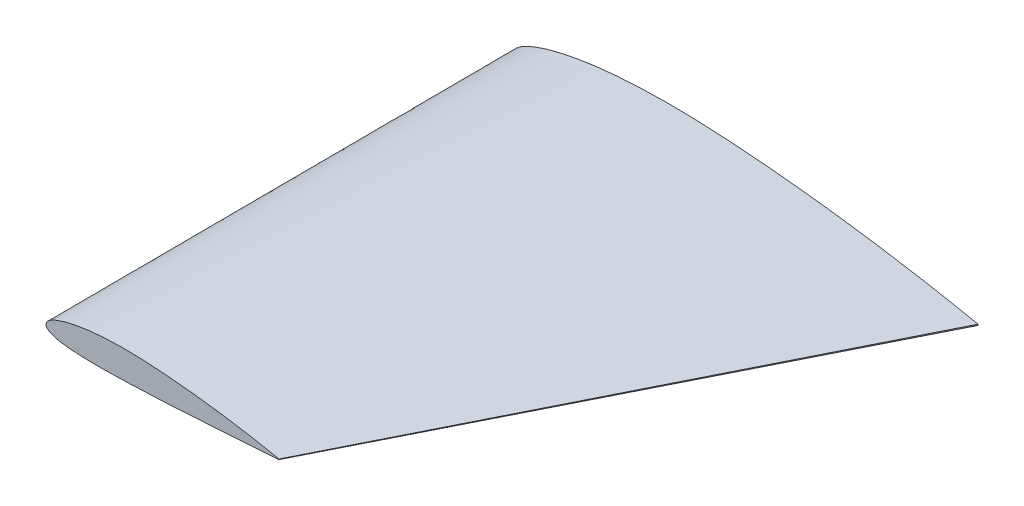
ISO-10303-21;
HEADER;
FILE_DESCRIPTION(('STEP AP214'),'2;1');
FILE_NAME('part.step','',(''),(''),'','','');
FILE_SCHEMA(('AUTOMOTIVE_DESIGN { 1 0 10303 214 1 1 1 1 }'));
ENDSEC;
DATA;
#1=APPLICATION_CONTEXT('core data for automotive mechanical design processes');
#2=APPLICATION_PROTOCOL_DEFINITION('international standard','automotive_design',2000,#1);
#3=PRODUCT_CONTEXT('',#1,'mechanical');
#4=PRODUCT('Part','Part','',(#3));
#5=PRODUCT_RELATED_PRODUCT_CATEGORY('part','',(#4));
#6=PRODUCT_DEFINITION_FORMATION('','',#4);
#7=PRODUCT_DEFINITION_CONTEXT('part definition',#1,'design');
#8=PRODUCT_DEFINITION('design','',#6,#7);
#9=PRODUCT_DEFINITION_SHAPE('','',#8);
#10=(LENGTH_UNIT() NAMED_UNIT(*) SI_UNIT(.MILLI.,.METRE.));
#11=(NAMED_UNIT(*) PLANE_ANGLE_UNIT() SI_UNIT($,.RADIAN.));
#12=(NAMED_UNIT(*) SI_UNIT($,.STERADIAN.) SOLID_ANGLE_UNIT());
#13=UNCERTAINTY_MEASURE_WITH_UNIT(LENGTH_MEASURE(1.E-05),#10,'distance_accuracy_value','');
#14=(GEOMETRIC_REPRESENTATION_CONTEXT(3) GLOBAL_UNCERTAINTY_ASSIGNED_CONTEXT((#13)) GLOBAL_UNIT_ASSIGNED_CONTEXT((#10,
#11,#12)) REPRESENTATION_CONTEXT('',''));
#15=CARTESIAN_POINT('',(0.,0.,0.));
#16=DIRECTION('',(0.,0.,1.));
#17=DIRECTION('',(1.,0.,0.));
#18=AXIS2_PLACEMENT_3D('',#15,#16,#17);
#19=CARTESIAN_POINT('',(0.0474942023796356,0.362779535333563,100.));
#20=DIRECTION('',(0.,0.,-1.));
#21=DIRECTION('',(-1.,0.,0.));
#22=AXIS2_PLACEMENT_3D('',#19,#20,#21);
#23=PLANE('',#22);
#24=CARTESIAN_POINT('',(50.0042,0.06285,100.));
#25=CARTESIAN_POINT('',(49.9787503208939,0.0681515408779686,100.));
#26=CARTESIAN_POINT('',(49.8770960081783,0.0893276229824436,100.));
#27=CARTESIAN_POINT('',(49.6489384785891,0.136683489370867,100.));
#28=CARTESIAN_POINT('',(49.2701415094304,0.214627614186905,100.));
#29=CARTESIAN_POINT('',(48.7428627202459,0.321624115873759,100.));
#30=CARTESIAN_POINT('',(48.0702166717391,0.455902247108572,100.));
#31=CARTESIAN_POINT('',(47.2560872043922,0.614960305443104,100.));
#32=CARTESIAN_POINT('',(46.305254560152,0.796054170764651,100.));
#33=CARTESIAN_POINT('',(45.2233170197372,0.996240875897276,100.));
#34=CARTESIAN_POINT('',(44.0166438216551,1.21211261946796,100.));
#35=CARTESIAN_POINT('',(42.6924447726698,1.44030751234326,100.));
#36=CARTESIAN_POINT('',(41.2586094418726,1.67737165349885,100.));
#37=CARTESIAN_POINT('',(39.7237398709336,1.91965685601623,100.));
#38=CARTESIAN_POINT('',(38.0970889627317,2.16359838588722,100.));
#39=CARTESIAN_POINT('',(36.3885501164969,2.40569281055512,100.));
#40=CARTESIAN_POINT('',(34.6085097978796,2.64231100068004,100.));
#41=CARTESIAN_POINT('',(32.7678510359656,2.86995189203715,100.));
#42=CARTESIAN_POINT('',(30.8778789601217,3.08535944017153,100.));
#43=CARTESIAN_POINT('',(28.9502308951007,3.28476381946373,100.));
#44=CARTESIAN_POINT('',(26.9968658516866,3.46526635096218,100.));
#45=CARTESIAN_POINT('',(25.0299180376006,3.62322388986461,100.));
#46=CARTESIAN_POINT('',(23.0616967066698,3.75605470727349,100.));
#47=CARTESIAN_POINT('',(21.1022971488884,3.860617181408,100.));
#48=CARTESIAN_POINT('',(19.1611200346032,3.93555294402119,100.));
#49=CARTESIAN_POINT('',(17.2501237020236,3.96707959022297,100.));
#50=CARTESIAN_POINT('',(15.3841597719049,3.95494837649114,100.));
#51=CARTESIAN_POINT('',(13.5784057428132,3.89887966716852,100.));
#52=CARTESIAN_POINT('',(11.8447981681396,3.79955254024002,100.));
#53=CARTESIAN_POINT('',(10.194804575866,3.65844393973575,100.));
#54=CARTESIAN_POINT('',(8.63925035051942,3.47803601710994,100.));
#55=CARTESIAN_POINT('',(7.18830146576011,3.26135690626958,100.));
#56=CARTESIAN_POINT('',(5.85126076701978,3.01224058873252,100.));
#57=CARTESIAN_POINT('',(4.63658778482368,2.73491121721397,100.));
#58=CARTESIAN_POINT('',(3.55161530454614,2.43433976452903,100.));
#59=CARTESIAN_POINT('',(2.60276441860869,2.115168266014,100.));
#60=CARTESIAN_POINT('',(1.79505140803959,1.7824667468098,100.));
#61=CARTESIAN_POINT('',(1.13224252541142,1.440663698548,100.));
#62=CARTESIAN_POINT('',(0.615990391680703,1.09315191705185,100.));
#63=CARTESIAN_POINT('',(0.246588870575284,0.74065659632003,100.));
#64=CARTESIAN_POINT('',(0.0242761352622945,0.376168780783406,100.));
#65=CARTESIAN_POINT('',(-0.0285068296811522,-0.00285520885615475,100.));
#66=CARTESIAN_POINT('',(0.0981216237119124,-0.363599767004052,100.));
#67=CARTESIAN_POINT('',(0.385885654781872,-0.677224455305556,100.));
#68=CARTESIAN_POINT('',(0.812849555282521,-0.951837373953946,100.));
#69=CARTESIAN_POINT('',(1.37887384048224,-1.19636133992195,100.));
#70=CARTESIAN_POINT('',(2.08301144224068,-1.41204451983937,100.));
#71=CARTESIAN_POINT('',(2.92231436887799,-1.59913003106045,100.));
#72=CARTESIAN_POINT('',(3.89219369558383,-1.75714214496304,100.));
#73=CARTESIAN_POINT('',(4.98694192534886,-1.88593892445276,100.));
#74=CARTESIAN_POINT('',(6.19999197219387,-1.9857271995877,100.));
#75=CARTESIAN_POINT('',(7.52410902909223,-2.05734927163072,100.));
#76=CARTESIAN_POINT('',(8.9514977724483,-2.10194737609152,100.));
#77=CARTESIAN_POINT('',(10.4738378106142,-2.12137948268366,100.));
#78=CARTESIAN_POINT('',(12.0823639955289,-2.11775490771724,100.));
#79=CARTESIAN_POINT('',(13.7678675171911,-2.09394954533398,100.));
#80=CARTESIAN_POINT('',(15.5207487182737,-2.05286362155699,100.));
#81=CARTESIAN_POINT('',(17.3310321776149,-1.99806311276751,100.));
#82=CARTESIAN_POINT('',(19.1912633395836,-1.93243554850442,100.));
#83=CARTESIAN_POINT('',(21.0929729390296,-1.86056227364106,100.));
#84=CARTESIAN_POINT('',(23.0244613766069,-1.77364601843777,100.));
#85=CARTESIAN_POINT('',(24.9712196743713,-1.67603728101522,100.));
#86=CARTESIAN_POINT('',(26.9192089763072,-1.56986322392175,100.));
#87=CARTESIAN_POINT('',(28.8566084634673,-1.45814063510328,100.));
#88=CARTESIAN_POINT('',(30.7715882233796,-1.34290086674459,100.));
#89=CARTESIAN_POINT('',(32.6523987631463,-1.2263938089715,100.));
#90=CARTESIAN_POINT('',(34.4874415882626,-1.11011209934819,100.));
#91=CARTESIAN_POINT('',(36.2653770661032,-0.995692317322224,100.));
#92=CARTESIAN_POINT('',(37.9751533270011,-0.884360057041441,100.));
#93=CARTESIAN_POINT('',(39.6060968914903,-0.777057548227086,100.));
#94=CARTESIAN_POINT('',(41.1479658621,-0.674771116200379,100.));
#95=CARTESIAN_POINT('',(42.5910599000477,-0.578044811401811,100.));
#96=CARTESIAN_POINT('',(43.9262468599148,-0.487844545047377,100.));
#97=CARTESIAN_POINT('',(45.1450431787814,-0.404619738184431,100.));
#98=CARTESIAN_POINT('',(46.2396598296934,-0.329165667834684,100.));
#99=CARTESIAN_POINT('',(47.2030894880734,-0.26202566822085,100.));
#100=CARTESIAN_POINT('',(48.0291325599693,-0.203841478310905,100.));
#101=CARTESIAN_POINT('',(48.7124474380052,-0.155330962892972,100.));
#102=CARTESIAN_POINT('',(49.2485894507964,-0.116885208124018,100.));
#103=CARTESIAN_POINT('',(49.6340732505381,-0.0891410060865956,100.));
#104=CARTESIAN_POINT('',(49.8663670653028,-0.0722554833190414,100.));
#105=CARTESIAN_POINT('',(49.9698833297323,-0.0647332827244311,100.));
#106=CARTESIAN_POINT('',(49.9958,-0.06285,100.));
#107=B_SPLINE_CURVE_WITH_KNOTS('',3,(#24,#25,#26,#27,#28,#29,#30,#31,#32,#33,#34,#35,#36,#37,
#38,#39,#40,#41,#42,#43,#44,#45,#46,#47,#48,#49,#50,#51,#52,#53,#54,#55,#56,#57,#58,#59,#60,#61,
#62,#63,#64,#65,#66,#67,#68,#69,#70,#71,#72,#73,#74,#75,#76,#77,#78,#79,#80,#81,#82,#83,#84,#85,
#86,#87,#88,#89,#90,#91,#92,#93,#94,#95,#96,#97,#98,#99,#100,#101,#102,#103,#104,#105,#106),
.UNSPECIFIED.,.F.,.F.,(4,1,1,1,1,1,1,1,1,1,1,1,1,1,1,1,1,1,1,1,1,1,1,1,1,1,1,1,1,1,1,1,1,1,1,1,
1,1,1,1,1,1,1,1,1,1,1,1,1,1,1,1,1,1,1,1,1,1,1,1,1,1,1,1,1,1,1,1,1,1,1,1,1,1,1,1,1,1,1,1,4),(0.,
0.00076417244153373,0.00305235378475402,0.00684980570482115,0.0121324733985665,
0.0188679915200487,0.0270128393038132,0.0365168120832152,0.047320748010187,0.0593568710051226,
0.0725508051219635,0.0868200523054509,0.102077397543794,0.118227703036746,0.135170889253622,
0.152802297170214,0.171012918486622,0.189689890020379,0.2087182097852,0.227978894661608,
0.247353901281394,0.266722824804597,0.285966042812018,0.305032180166146,0.323824436620937,
0.342143816816601,0.359879710568799,0.37692581771828,0.393181852747689,0.408552719103574,
0.422951452754658,0.436298148768817,0.448522824449468,0.459565427988144,0.469379445279197,
0.477933615883346,0.48522033832909,0.491267538221565,0.49616782391953,0.500133390493784,
0.503587222302178,0.507040596825175,0.511000027817938,0.515876124661788,0.521872238721079,
0.529071214980825,0.537494990853373,0.547131181284723,0.557945450904502,0.569889642117144,
0.582904388224719,0.59692167175937,0.611866369391749,0.627656322240658,0.644204240139434,
0.661417059233681,0.679197208253312,0.697442956346586,0.716133922541477,0.735139063012098,
0.754277540168221,0.773432072201266,0.792486536790152,0.811323415788078,0.829826150136362,
0.847880343752471,0.865374072591972,0.882198024915322,0.898246949642392,0.91342054427208,
0.927622056045171,0.940762976250731,0.952758837637558,0.963532927047773,0.973016417754069,
0.981148267698661,0.987875251513711,0.993153530447754,0.996949037264165,0.999236150998499,1.),.UNSPECIFIED.);
#108=CARTESIAN_POINT('',(50.0042,0.06285,100.));
#109=VERTEX_POINT('',#108);
#110=CARTESIAN_POINT('',(49.9958,-0.06285,100.));
#111=VERTEX_POINT('',#110);
#112=EDGE_CURVE('E59',#109,#111,#107,.T.);
#113=ORIENTED_EDGE('',*,*,#112,.T.);
#114=DIRECTION('',(0.0666770621437419,0.997774608508294,0.));
#115=VECTOR('',#114,1.);
#116=CARTESIAN_POINT('',(50.0042,0.06285,100.));
#117=LINE('',#116,#115);
#118=EDGE_CURVE('E12',#111,#109,#117,.T.);
#119=ORIENTED_EDGE('',*,*,#118,.T.);
#120=EDGE_LOOP('',(#113,#119));
#121=FACE_BOUND('',#120,.T.);
#122=ADVANCED_FACE('F49',(#121),#23,.F.);
#123=CARTESIAN_POINT('',(0.0989233809148192,0.725611215348405,0.));
#124=DIRECTION('',(0.,0.,-1.));
#125=DIRECTION('',(-1.,0.,0.));
#126=AXIS2_PLACEMENT_3D('',#123,#124,#125);
#127=PLANE('',#126);
#128=CARTESIAN_POINT('',(100.01,0.13,0.));
#129=CARTESIAN_POINT('',(99.9600101889149,0.14005087388315,0.));
#130=CARTESIAN_POINT('',(99.7568451287261,0.180898925778012,0.));
#131=CARTESIAN_POINT('',(99.2987370964134,0.267106975332707,0.));
#132=CARTESIAN_POINT('',(98.5417513822749,0.435255628682558,0.));
#133=CARTESIAN_POINT('',(97.4825966075312,0.63635325301395,0.));
#134=CARTESIAN_POINT('',(96.137397662835,0.910311353413393,0.));
#135=CARTESIAN_POINT('',(94.5112596740484,1.22991194492113,0.));
#136=CARTESIAN_POINT('',(92.6096856205093,1.58496434163489,0.));
#137=CARTESIAN_POINT('',(90.4495107571499,2.00218218771386,0.));
#138=CARTESIAN_POINT('',(88.033691307481,2.4220673595466,0.));
#139=CARTESIAN_POINT('',(85.3862128687886,2.89043291578856,0.));
#140=CARTESIAN_POINT('',(82.5169126265505,3.34818011576674,0.));
#141=CARTESIAN_POINT('',(79.4502268367967,3.84984991741541,0.));
#142=CARTESIAN_POINT('',(76.1938089103401,4.31669723693996,0.));
#143=CARTESIAN_POINT('',(72.7796448880406,4.81491351525294,0.));
#144=CARTESIAN_POINT('',(69.2180470462988,5.27749679553791,0.));
#145=CARTESIAN_POINT('',(65.5393406846143,5.74237674472258,0.));
#146=CARTESIAN_POINT('',(61.7585409024255,6.16729325081734,0.));
#147=CARTESIAN_POINT('',(57.9023420180925,6.57065314746,0.));
#148=CARTESIAN_POINT('',(53.9949801287777,6.92556228394881,0.));
#149=CARTESIAN_POINT('',(50.0590489661475,7.25226415378494,0.));
#150=CARTESIAN_POINT('',(46.1213323489905,7.50608575877448,0.));
#151=CARTESIAN_POINT('',(42.201356847948,7.71837457822412,0.));
#152=CARTESIAN_POINT('',(38.3212771310937,7.87537322501496,0.));
#153=CARTESIAN_POINT('',(34.5001467360365,7.93514300786231,0.));
#154=CARTESIAN_POINT('',(30.7692465885632,7.90332910173284,0.));
#155=CARTESIAN_POINT('',(27.1579461360117,7.79842090198703,0.));
#156=CARTESIAN_POINT('',(23.6895505953669,7.60165313128005,0.));
#157=CARTESIAN_POINT('',(20.3923934441692,7.30931841297664,0.));
#158=CARTESIAN_POINT('',(17.2794518620562,6.95759262085992,0.));
#159=CARTESIAN_POINT('',(14.3789743512689,6.51603641439553,0.));
#160=CARTESIAN_POINT('',(11.7017959126549,6.02546648201291,0.));
#161=CARTESIAN_POINT('',(9.27492430269259,5.46369335857864,0.));
#162=CARTESIAN_POINT('',(7.10075075199694,4.87616176836274,0.));
#163=CARTESIAN_POINT('',(5.2062417103521,4.22777992177866,0.));
#164=CARTESIAN_POINT('',(3.5898038178308,3.56898331365378,0.));
#165=CARTESIAN_POINT('',(2.26433647412073,2.88414353080694,0.));
#166=CARTESIAN_POINT('',(1.23351405866163,2.18451611389959,0.));
#167=CARTESIAN_POINT('',(0.490296435619297,1.48061848255727,0.));
#168=CARTESIAN_POINT('',(0.0540478583234619,0.748776545424901,0.));
#169=CARTESIAN_POINT('',(-0.0574069101351037,-0.00463408099004096,0.));
#170=CARTESIAN_POINT('',(0.191826714890395,-0.730008426704529,0.));
#171=CARTESIAN_POINT('',(0.776315368215505,-1.34811694686585,0.));
#172=CARTESIAN_POINT('',(1.62270556994627,-1.90676677758909,0.));
#173=CARTESIAN_POINT('',(2.75793141962963,-2.39064505879246,0.));
#174=CARTESIAN_POINT('',(4.16801287125033,-2.82004507255173,0.));
#175=CARTESIAN_POINT('',(5.84510474599785,-3.20621244847002,0.));
#176=CARTESIAN_POINT('',(7.78714561311209,-3.51497038708938,0.));
#177=CARTESIAN_POINT('',(9.97581357484473,-3.77232079310088,0.));
#178=CARTESIAN_POINT('',(12.401252439848,-3.9641013311197,0.));
#179=CARTESIAN_POINT('',(15.0484291224028,-4.11572350344778,0.));
#180=CARTESIAN_POINT('',(17.9028028255853,-4.20005016129916,0.));
#181=CARTESIAN_POINT('',(20.9465281163786,-4.23594060761608,0.));
#182=CARTESIAN_POINT('',(24.1635408389622,-4.23957303536041,0.));
#183=CARTESIAN_POINT('',(27.5335820452624,-4.18214870085851,0.));
#184=CARTESIAN_POINT('',(31.0403656844393,-4.10404560587678,0.));
#185=CARTESIAN_POINT('',(34.6603072729446,-3.99229271494064,0.));
#186=CARTESIAN_POINT('',(38.3800101560417,-3.85735961686038,0.));
#187=CARTESIAN_POINT('',(42.1842612621346,-3.72899582224647,0.));
#188=CARTESIAN_POINT('',(46.0467630070507,-3.53837637217277,0.));
#189=CARTESIAN_POINT('',(49.9438583106063,-3.35384381985648,0.));
#190=CARTESIAN_POINT('',(53.840676136571,-3.14514530413376,0.));
#191=CARTESIAN_POINT('',(57.7166692559598,-2.91001965883529,0.));
#192=CARTESIAN_POINT('',(61.5468059949118,-2.68232502863085,0.));
#193=CARTESIAN_POINT('',(65.3068709640907,-2.45328724294273,0.));
#194=CARTESIAN_POINT('',(68.9768184204685,-2.2224225323619,0.));
#195=CARTESIAN_POINT('',(72.5304585413205,-1.99695333764241,0.));
#196=CARTESIAN_POINT('',(75.9494678593729,-1.75858317129049,0.));
#197=CARTESIAN_POINT('',(79.2105850101347,-1.5588500924988,0.));
#198=CARTESIAN_POINT('',(82.2929815890537,-1.34138600595554,0.));
#199=CARTESIAN_POINT('',(85.1801639588338,-1.15581902885384,0.));
#200=CARTESIAN_POINT('',(87.8502583496636,-0.977096539177488,0.));
#201=CARTESIAN_POINT('',(90.2898591035178,-0.804621830807451,0.));
#202=CARTESIAN_POINT('',(92.4798948505242,-0.655135672257377,0.));
#203=CARTESIAN_POINT('',(94.4070353463351,-0.528598762678701,0.));
#204=CARTESIAN_POINT('',(96.0567884960726,-0.408402197073076,0.));
#205=CARTESIAN_POINT('',(97.4227464610444,-0.30155598290059,0.));
#206=CARTESIAN_POINT('',(98.4973487643532,-0.242925695646969,0.));
#207=CARTESIAN_POINT('',(99.2695634286523,-0.173821282883332,0.));
#208=CARTESIAN_POINT('',(99.7333768332108,-0.147323045447989,0.));
#209=CARTESIAN_POINT('',(99.9400028496036,-0.133374998911525,0.));
#210=CARTESIAN_POINT('',(99.99,-0.13,0.));
#211=B_SPLINE_CURVE_WITH_KNOTS('',3,(#128,#129,#130,#131,#132,#133,#134,#135,#136,#137,#138,
#139,#140,#141,#142,#143,#144,#145,#146,#147,#148,#149,#150,#151,#152,#153,#154,#155,#156,#157,
#158,#159,#160,#161,#162,#163,#164,#165,#166,#167,#168,#169,#170,#171,#172,#173,#174,#175,#176,
#177,#178,#179,#180,#181,#182,#183,#184,#185,#186,#187,#188,#189,#190,#191,#192,#193,#194,#195,
#196,#197,#198,#199,#200,#201,#202,#203,#204,#205,#206,#207,#208,#209,#210),.UNSPECIFIED.,.F.,
.F.,(4,1,1,1,1,1,1,1,1,1,1,1,1,1,1,1,1,1,1,1,1,1,1,1,1,1,1,1,1,1,1,1,1,1,1,1,1,1,1,1,1,1,1,1,1,
1,1,1,1,1,1,1,1,1,1,1,1,1,1,1,1,1,1,1,1,1,1,1,1,1,1,1,1,1,1,1,1,1,1,1,4),(0.,
0.00074945818737412,0.00304589504224225,0.00685103071382452,0.0121452889360257,
0.0188904126223928,0.0270288109104254,0.036503218304691,0.0473229342065968,0.0593651021840326,
0.0725425630038189,0.0868393832291239,0.102070803757523,0.118214924548748,0.135190345862375,
0.152783420003456,0.171001997067524,0.189689705586988,0.208702510762227,0.227988826995787,
0.247355873244158,0.266750229264171,0.285983265266755,0.305055945103883,0.3238228018441,
0.342147003110028,0.359890877787497,0.376919876960416,0.393198885468495,0.408537643009881,
0.42295683911984,0.436313688141813,0.448531186771594,0.459561715788133,0.469400165445081,
0.477943898877156,0.485197932535745,0.49128675674895,0.496206164558205,0.500132078854596,
0.50358986197993,0.507044867211163,0.511003963554511,0.515868908580936,0.521878170617564,
0.529068056559583,0.537517857272131,0.547151053446048,0.557956006126307,0.569901710325695,
0.582905800680243,0.596924910584584,0.611869247995216,0.627645191827238,0.644206845284332,
0.661408070007897,0.679200915758404,0.697437665839834,0.716116830701602,0.735146798185225,
0.754276969606538,0.773461082326143,0.792503974416083,0.811351239030967,0.829856173233254,
0.847872105221554,0.865399087158936,0.88219275179226,0.898246666681736,0.913420614713101,
0.927610336094519,0.940770206968758,0.952753628414133,0.963557248082171,0.97303444195515,
0.981139739165156,0.987869721463283,0.993172134460812,0.996956078488459,0.9992634644743,1.),.UNSPECIFIED.);
#212=CARTESIAN_POINT('',(100.01,0.13,0.));
#213=VERTEX_POINT('',#212);
#214=CARTESIAN_POINT('',(99.99,-0.13,0.));
#215=VERTEX_POINT('',#214);
#216=EDGE_CURVE('E83',#213,#215,#211,.T.);
#217=ORIENTED_EDGE('',*,*,#216,.F.);
#218=DIRECTION('',(0.0766964988847604,0.99705448550158,0.));
#219=VECTOR('',#218,1.);
#220=CARTESIAN_POINT('',(100.01,0.13,0.));
#221=LINE('',#220,#219);
#222=EDGE_CURVE('E87',#215,#213,#221,.T.);
#223=ORIENTED_EDGE('',*,*,#222,.F.);
#224=EDGE_LOOP('',(#217,#223));
#225=FACE_BOUND('',#224,.T.);
#226=ADVANCED_FACE('F96',(#225),#127,.T.);
#227=CARTESIAN_POINT('',(100.01,0.13,0.));
#228=CARTESIAN_POINT('',(50.0042,0.06285,100.));
#229=CARTESIAN_POINT('',(99.9600101889149,0.14005087388315,0.));
#230=CARTESIAN_POINT('',(49.979240358255,0.0680494589188764,100.));
#231=CARTESIAN_POINT('',(99.909038918426,0.15029907847178,0.));
#232=CARTESIAN_POINT('',(49.9537906791488,0.073350999796845,100.));
#233=CARTESIAN_POINT('',(99.7057471920562,0.190514678277142,0.));
#234=CARTESIAN_POINT('',(49.8523477024469,0.0944642031204029,100.));
#235=CARTESIAN_POINT('',(99.5517618640314,0.219504590515275,0.));
#236=CARTESIAN_POINT('',(49.7756414679806,0.110385300363287,100.));
#237=CARTESIAN_POINT('',(99.1458453973115,0.301070421791457,0.));
#238=CARTESIAN_POINT('',(49.5729104416049,0.152327592377762,100.));
#239=CARTESIAN_POINT('',(98.893081894139,0.357209029743854,0.));
#240=CARTESIAN_POINT('',(49.4461215867812,0.178416624577801,100.));
#241=CARTESIAN_POINT('',(98.2883257957729,0.48335658180089,0.));
#242=CARTESIAN_POINT('',(49.1434971208078,0.240326555276209,100.));
#243=CARTESIAN_POINT('',(97.9343429961565,0.550581911828408,0.));
#244=CARTESIAN_POINT('',(48.9669505777787,0.276151685337489,100.));
#245=CARTESIAN_POINT('',(97.1319938826859,0.7077672718692,0.));
#246=CARTESIAN_POINT('',(48.5662034961804,0.356890019130845,100.));
#247=CARTESIAN_POINT('',(96.6814577886183,0.799510137615276,0.));
#248=CARTESIAN_POINT('',(48.3407560571852,0.401894527411489,100.));
#249=CARTESIAN_POINT('',(95.6896547678501,0.998306430491818,0.));
#250=CARTESIAN_POINT('',(47.844586707695,0.499984012260616,100.));
#251=CARTESIAN_POINT('',(95.1448383985669,1.10538860402438,0.));
#252=CARTESIAN_POINT('',(47.5721179172434,0.553215067650272,100.));
#253=CARTESIAN_POINT('',(93.9680297750252,1.33134111474799,0.));
#254=CARTESIAN_POINT('',(46.9838234457855,0.666813969435671,100.));
#255=CARTESIAN_POINT('',(93.3324017323512,1.45002240383576,0.));
#256=CARTESIAN_POINT('',(46.6662201857571,0.727303954463361,100.));
#257=CARTESIAN_POINT('',(91.9760008232904,1.70735521441239,0.));
#258=CARTESIAN_POINT('',(45.9877926738715,0.85479291181556,100.));
#259=CARTESIAN_POINT('',(91.2532052271433,1.84694767908919,0.));
#260=CARTESIAN_POINT('',(45.6258632484059,0.921759309105663,100.));
#261=CARTESIAN_POINT('',(89.7249318368255,2.12811312749813,0.));
#262=CARTESIAN_POINT('',(44.8614515465585,1.06097798181567,100.));
#263=CARTESIAN_POINT('',(88.9175656246676,2.26844424023555,0.));
#264=CARTESIAN_POINT('',(44.4581212587988,1.1331328412658,100.));
#265=CARTESIAN_POINT('',(87.2274551958172,2.56469863441669,0.));
#266=CARTESIAN_POINT('',(43.6131376129079,1.28164657731657,100.));
#267=CARTESIAN_POINT('',(86.343502893424,2.72107868486432,0.));
#268=CARTESIAN_POINT('',(43.1708160340971,1.35787042951466,100.));
#269=CARTESIAN_POINT('',(84.5015919640305,3.0315471681254,0.));
#270=CARTESIAN_POINT('',(42.2498914480607,1.5134773677378,100.));
#271=CARTESIAN_POINT('',(83.5410227882672,3.18480214672281,0.));
#272=CARTESIAN_POINT('',(41.7700451629607,1.59281308015931,100.));
#273=CARTESIAN_POINT('',(81.5582458952144,3.50500549075736,0.));
#274=CARTESIAN_POINT('',(40.7786952991939,1.753127135199,100.));
#275=CARTESIAN_POINT('',(80.5337864136138,3.67259370166858,0.));
#276=CARTESIAN_POINT('',(40.2660062383472,1.83405548464813,100.));
#277=CARTESIAN_POINT('',(78.4239526888696,3.99697886274044,0.));
#278=CARTESIAN_POINT('',(39.2110936209367,1.99653436886952,100.));
#279=CARTESIAN_POINT('',(77.3357920905115,4.15298054256926,0.));
#280=CARTESIAN_POINT('',(38.6675327673796,2.07805149090835,100.));
#281=CARTESIAN_POINT('',(75.1073758449887,4.47523810086486,0.));
#282=CARTESIAN_POINT('',(37.553537531912,2.24061786438003,100.));
#283=CARTESIAN_POINT('',(73.9645254683071,4.64200150622735,0.));
#284=CARTESIAN_POINT('',(36.9817637687476,2.3216363560219,100.));
#285=CARTESIAN_POINT('',(71.6356085849088,4.96350189872101,0.));
#286=CARTESIAN_POINT('',(35.8171665196661,2.48164316741781,100.));
#287=CARTESIAN_POINT('',(70.4459994365654,5.1180093211055,0.));
#288=CARTESIAN_POINT('',(35.2225944151533,2.56067863149708,100.));
#289=CARTESIAN_POINT('',(68.0292404686581,5.42772687292602,0.));
#290=CARTESIAN_POINT('',(34.0142478354104,2.71580378198056,100.));
#291=CARTESIAN_POINT('',(66.7987484173547,5.58321594936929,0.));
#292=CARTESIAN_POINT('',(33.3987876529543,2.79192169064784,100.));
#293=CARTESIAN_POINT('',(64.3068084141614,5.88089857507104,0.));
#294=CARTESIAN_POINT('',(32.1527027782858,2.940062726895,100.));
#295=CARTESIAN_POINT('',(63.0432828867579,6.02290082255479,0.));
#296=CARTESIAN_POINT('',(31.5210472443868,3.01205502212108,100.));
#297=CARTESIAN_POINT('',(60.4939639458541,6.29956849019144,0.));
#298=CARTESIAN_POINT('',(30.2464138288485,3.1506781461237,100.));
#299=CARTESIAN_POINT('',(59.2063384151425,6.43425453385225,0.));
#300=CARTESIAN_POINT('',(29.6025164630703,3.21728853641676,100.));
#301=CARTESIAN_POINT('',(56.6136753377106,6.68769922535325,0.));
#302=CARTESIAN_POINT('',(28.3061794680727,3.34427799649157,100.));
#303=CARTESIAN_POINT('',(55.3068672859914,6.80639825869047,0.));
#304=CARTESIAN_POINT('',(27.6528566221066,3.40464890769439,100.));
#305=CARTESIAN_POINT('',(52.6880767185241,7.03404124533771,0.));
#306=CARTESIAN_POINT('',(26.3433954616879,3.51774388687371,100.));
#307=CARTESIAN_POINT('',(51.3742188594389,7.14309850897642,0.));
#308=CARTESIAN_POINT('',(25.6863181769759,3.57050891652184,100.));
#309=CARTESIAN_POINT('',(48.7460551669614,7.33688128644747,0.));
#310=CARTESIAN_POINT('',(24.3722174299377,3.66761062013384,100.));
#311=CARTESIAN_POINT('',(47.4290811387494,7.42178947008437,0.));
#312=CARTESIAN_POINT('',(23.7138600291983,3.71204120061874,100.));
#313=CARTESIAN_POINT('',(44.8067675505868,7.57727086162881,0.));
#314=CARTESIAN_POINT('',(22.4027804351219,3.79121747707555,100.));
#315=CARTESIAN_POINT('',(43.4982694321009,7.64813943482948,0.));
#316=CARTESIAN_POINT('',(21.7484800938643,3.82612700592832,100.));
#317=CARTESIAN_POINT('',(40.8965845631378,7.7711582191776,0.));
#318=CARTESIAN_POINT('',(20.4475358374836,3.88589310179603,100.));
#319=CARTESIAN_POINT('',(39.5987578323115,7.82368285882959,0.));
#320=CARTESIAN_POINT('',(19.7985718051334,3.91093869795458,100.));
#321=CARTESIAN_POINT('',(37.0252738643945,7.89564519320539,0.));
#322=CARTESIAN_POINT('',(18.5117954421672,3.94626456207492,100.));
#323=CARTESIAN_POINT('',(35.7467324943116,7.91564402395716,0.));
#324=CARTESIAN_POINT('',(17.8725402295614,3.95680186373012,100.));
#325=CARTESIAN_POINT('',(33.2233788642354,7.92425324186942,0.));
#326=CARTESIAN_POINT('',(16.6108492986336,3.96292346785874,100.));
#327=CARTESIAN_POINT('',(31.9766231846285,7.91362341134704,0.));
#328=CARTESIAN_POINT('',(15.9874429509013,3.95887050867553,100.));
#329=CARTESIAN_POINT('',(29.5239359217799,7.86714518130406,0.));
#330=CARTESIAN_POINT('',(14.7610865565336,3.93560193703342,100.));
#331=CARTESIAN_POINT('',(28.3169018876571,7.83208854141157,0.));
#332=CARTESIAN_POINT('',(14.157583919879,3.91686171524078,100.));
#333=CARTESIAN_POINT('',(25.9532100786475,7.73007424846383,0.));
#334=CARTESIAN_POINT('',(12.9757937092544,3.86435038583663,100.));
#335=CARTESIAN_POINT('',(24.7951207136467,7.66437393834629,0.));
#336=CARTESIAN_POINT('',(12.3967893248317,3.83117343188534,100.));
#337=CARTESIAN_POINT('',(22.5361203729275,7.49936888906115,0.));
#338=CARTESIAN_POINT('',(11.2671440184612,3.7501511552781,100.));
#339=CARTESIAN_POINT('',(21.4327686776893,7.40155582107728,0.));
#340=CARTESIAN_POINT('',(10.7152927864235,3.70295645379317,100.));
#341=CARTESIAN_POINT('',(19.2927861229864,7.18507571652429,0.));
#342=CARTESIAN_POINT('',(9.64532485141181,3.59470958166165,100.));
#343=CARTESIAN_POINT('',(18.2534341156442,7.06764116196307,0.));
#344=CARTESIAN_POINT('',(9.12582758473173,3.53445773741716,100.));
#345=CARTESIAN_POINT('',(16.2469111893575,6.80039615589292,0.));
#346=CARTESIAN_POINT('',(8.12249754910514,3.40086614661289,100.));
#347=CARTESIAN_POINT('',(15.2768851688259,6.65271425299008,0.));
#348=CARTESIAN_POINT('',(7.63726299870177,3.32840309017113,100.));
#349=CARTESIAN_POINT('',(13.4151527995466,6.33940880839831,0.));
#350=CARTESIAN_POINT('',(6.70646899310023,3.17158227833799,100.));
#351=CARTESIAN_POINT('',(12.5206787247136,6.17551971714537,0.));
#352=CARTESIAN_POINT('',(6.25948939809292,3.08829748826868,100.));
#353=CARTESIAN_POINT('',(10.8178356205775,5.82083411550559,0.));
#354=CARTESIAN_POINT('',(5.40796701912655,2.91102949874922,100.));
#355=CARTESIAN_POINT('',(10.0067932347486,5.63310664530458,0.));
#356=CARTESIAN_POINT('',(5.00213761668342,2.81835906777697,100.));
#357=CARTESIAN_POINT('',(8.47263939959959,5.24689018535927,0.));
#358=CARTESIAN_POINT('',(4.23550133005821,2.62379482719435,100.));
#359=CARTESIAN_POINT('',(7.74700951991949,5.05080166382417,0.));
#360=CARTESIAN_POINT('',(3.87333702969772,2.5234583127095,100.));
#361=CARTESIAN_POINT('',(6.39136898554575,4.633334847798,0.));
#362=CARTESIAN_POINT('',(3.19547861743903,2.31454361764779,100.));
#363=CARTESIAN_POINT('',(5.75765230908895,4.41648799586616,0.));
#364=CARTESIAN_POINT('',(2.87807057712045,2.20777489205493,100.));
#365=CARTESIAN_POINT('',(4.58786024360135,3.97573176293625,0.));
#366=CARTESIAN_POINT('',(2.29312991613216,1.9876280778234,100.));
#367=CARTESIAN_POINT('',(4.04784007239262,3.75566090411343,0.));
#368=CARTESIAN_POINT('',(2.02350219024542,1.87653169900709,100.));
#369=CARTESIAN_POINT('',(3.07301206492364,3.30196839735465,0.));
#370=CARTESIAN_POINT('',(1.53639596521484,1.64904742992564,100.));
#371=CARTESIAN_POINT('',(2.63172303501401,3.07396407506777,0.));
#372=CARTESIAN_POINT('',(1.31574021092769,1.53526640672115,100.));
#373=CARTESIAN_POINT('',(1.85473508853711,2.60605805352163,0.));
#374=CARTESIAN_POINT('',(0.926573106456961,1.3022186607258,100.));
#375=CARTESIAN_POINT('',(1.51109501748618,2.37274752431746,0.));
#376=CARTESIAN_POINT('',(0.75418456697443,1.18617643145272,100.));
#377=CARTESIAN_POINT('',(0.933475031129978,1.90009009825735,0.));
#378=CARTESIAN_POINT('',(0.465723084411205,0.949761812666351,100.));
#379=CARTESIAN_POINT('',(0.687582846711614,1.66746743925377,0.));
#380=CARTESIAN_POINT('',(0.343463576258806,0.83296530192496,100.));
#381=CARTESIAN_POINT('',(0.317221543640902,1.19027148589864,0.));
#382=CARTESIAN_POINT('',(0.157497316606235,0.594578692095057,100.));
#383=CARTESIAN_POINT('',(0.176608849226622,0.954382426263352,0.));
#384=CARTESIAN_POINT('',(0.0862036835037596,0.477149610590234,100.));
#385=CARTESIAN_POINT('',(0.0137223059471719,0.475961672862389,0.));
#386=CARTESIAN_POINT('',(0.00503126267272469,0.237975172356538,100.));
#387=CARTESIAN_POINT('',(-0.0218435407107142,0.23562143009516,0.));
#388=CARTESIAN_POINT('',(-0.0117548917949938,0.117437130511458,100.));
#389=CARTESIAN_POINT('',(0.0217739102319117,-0.23487106814585,0.));
#390=CARTESIAN_POINT('',(0.0117712826208957,-0.117601219220279,100.));
#391=CARTESIAN_POINT('',(0.100968111757352,-0.46557179704262,0.));
#392=CARTESIAN_POINT('',(0.0520775528080574,-0.232376732509516,100.));
#393=CARTESIAN_POINT('',(0.355947962955905,-0.903480582604759,0.));
#394=CARTESIAN_POINT('',(0.179087832727313,-0.45184221332715,100.));
#395=CARTESIAN_POINT('',(0.54455425085544,-1.10302489851315,0.));
#396=CARTESIAN_POINT('',(0.271906603943429,-0.552977750431644,100.));
#397=CARTESIAN_POINT('',(1.00199734155135,-1.49707566111318,0.));
#398=CARTESIAN_POINT('',(0.499794181798175,-0.750446060185387,100.));
#399=CARTESIAN_POINT('',(1.28022805511879,-1.68071854913175,0.));
#400=CARTESIAN_POINT('',(0.640147261314239,-0.840747751383856,100.));
#401=CARTESIAN_POINT('',(1.92853942999705,-2.03708161968179,0.));
#402=CARTESIAN_POINT('',(0.965352250803191,-1.01771893576073,100.));
#403=CARTESIAN_POINT('',(2.30617606217361,-2.19806298821733,0.));
#404=CARTESIAN_POINT('',(1.15357387776112,-1.09903116901316,100.));
#405=CARTESIAN_POINT('',(3.14895199985825,-2.50971920329478,0.));
#406=CARTESIAN_POINT('',(1.5742628456189,-1.2562038321242,100.));
#407=CARTESIAN_POINT('',(3.61784972968913,-2.6525086084101,0.));
#408=CARTESIAN_POINT('',(1.8087368550959,-1.32802437014024,100.));
#409=CARTESIAN_POINT('',(4.64383629481366,-2.92954849668845,0.));
#410=CARTESIAN_POINT('',(2.32211373071486,-1.46534181269232,100.));
#411=CARTESIAN_POINT('',(5.20454565347095,-3.05871018265255,0.));
#412=CARTESIAN_POINT('',(2.60288330171627,-1.52792698552923,100.));
#413=CARTESIAN_POINT('',(6.41029280379204,-3.29601943138598,0.));
#414=CARTESIAN_POINT('',(3.20603525278538,-1.64535365434025,100.));
#415=CARTESIAN_POINT('',(7.05942860525894,-3.39927333506139,0.));
#416=CARTESIAN_POINT('',(3.53038250851155,-1.69817958242748,100.));
#417=CARTESIAN_POINT('',(8.43615230362989,-3.59126705773996,0.));
#418=CARTESIAN_POINT('',(4.21851168381461,-1.79553335202871,100.));
#419=CARTESIAN_POINT('',(9.16774784239331,-3.67730590369494,0.));
#420=CARTESIAN_POINT('',(4.58432803592721,-1.83856018691251,100.));
#421=CARTESIAN_POINT('',(10.7072391670954,-3.83013843428924,0.));
#422=CARTESIAN_POINT('',(5.35400586521865,-1.91613444484296,100.));
#423=CARTESIAN_POINT('',(11.5182956496573,-3.89428554202129,0.));
#424=CARTESIAN_POINT('',(5.75943645651003,-1.94948125459466,100.));
#425=CARTESIAN_POINT('',(13.2118142732437,-4.01052674089572,0.));
#426=CARTESIAN_POINT('',(6.6061751959408,-2.00769782821325,100.));
#427=CARTESIAN_POINT('',(14.0960082015629,-4.06117175027614,0.));
#428=CARTESIAN_POINT('',(7.04836595752709,-2.03161160606026,100.));
#429=CARTESIAN_POINT('',(15.9325711280489,-4.14184051250319,0.));
#430=CARTESIAN_POINT('',(7.96671423966912,-2.07117826776655,100.));
#431=CARTESIAN_POINT('',(16.8861606563474,-4.1700155388995,0.));
#432=CARTESIAN_POINT('',(8.44347213542009,-2.08607391899143,100.));
#433=CARTESIAN_POINT('',(18.8561394654732,-4.21128974928232,0.));
#434=CARTESIAN_POINT('',(9.42843811064287,-2.10803534281218,100.));
#435=CARTESIAN_POINT('',(19.8730579668176,-4.22328265754018,0.));
#436=CARTESIAN_POINT('',(9.93691432352637,-2.11452504852569,100.));
#437=CARTESIAN_POINT('',(21.9631291370823,-4.23708848301197,0.));
#438=CARTESIAN_POINT('',(10.981967246352,-2.12023156767239,100.));
#439=CARTESIAN_POINT('',(23.0374607930626,-4.23830154383899,0.));
#440=CARTESIAN_POINT('',(11.5191324779553,-2.11902349919603,100.));
#441=CARTESIAN_POINT('',(25.2373312203957,-4.22127437107267,0.));
#442=CARTESIAN_POINT('',(12.6190923613203,-2.11017437579617,100.));
#443=CARTESIAN_POINT('',(26.3639921016464,-4.20207616542222,0.));
#444=CARTESIAN_POINT('',(13.1824493058055,-2.10221775272049,100.));
#445=CARTESIAN_POINT('',(28.659916723039,-4.15706297177707,0.));
#446=CARTESIAN_POINT('',(14.3304372446785,-2.08076197608865,100.));
#447=CARTESIAN_POINT('',(29.83072042399,-4.1309868284876,0.));
#448=CARTESIAN_POINT('',(14.91583711628,-2.06704189579073,100.));
#449=CARTESIAN_POINT('',(32.2104875452158,-4.06792113066404,0.));
#450=CARTESIAN_POINT('',(16.1057329340278,-2.03515510608019,100.));
#451=CARTESIAN_POINT('',(33.4204831810176,-4.03056626720794,0.));
#452=CARTESIAN_POINT('',(16.7107455386035,-2.01684029555496,100.));
#453=CARTESIAN_POINT('',(35.8698084201146,-3.94841777598762,0.));
#454=CARTESIAN_POINT('',(17.9354572064163,-1.97673899362204,100.));
#455=CARTESIAN_POINT('',(37.1103549235675,-3.9034166594242,0.));
#456=CARTESIAN_POINT('',(18.5557652369701,-1.95485528980311,100.));
#457=CARTESIAN_POINT('',(39.620446450451,-3.81550456962856,0.));
#458=CARTESIAN_POINT('',(19.8107556368956,-1.90902169667953,100.));
#459=CARTESIAN_POINT('',(40.8917687657826,-3.77260457786491,0.));
#460=CARTESIAN_POINT('',(20.4463236288889,-1.88500175883979,100.));
#461=CARTESIAN_POINT('',(43.4542352497888,-3.66631682608594,0.));
#462=CARTESIAN_POINT('',(21.727593094157,-1.83200460470187,100.));
#463=CARTESIAN_POINT('',(44.7474125031681,-3.60250215585871,0.));
#464=CARTESIAN_POINT('',(22.3743148556366,-1.80290236801606,100.));
#465=CARTESIAN_POINT('',(47.3395072682497,-3.47716324305231,0.));
#466=CARTESIAN_POINT('',(23.6704222454894,-1.74125806241319,100.));
#467=CARTESIAN_POINT('',(48.6401514885401,-3.41557604055135,0.));
#468=CARTESIAN_POINT('',(24.320669903605,-1.70865469729957,100.));
#469=CARTESIAN_POINT('',(51.2416201133045,-3.28433458393753,0.));
#470=CARTESIAN_POINT('',(25.6212995270898,-1.64060504566913,100.));
#471=CARTESIAN_POINT('',(52.5449794078374,-3.21453767979868,0.));
#472=CARTESIAN_POINT('',(26.2729489177771,-1.6050872635422,100.));
#473=CARTESIAN_POINT('',(55.140341371577,-3.06630076108822,0.));
#474=CARTESIAN_POINT('',(27.5707229435279,-1.53229284798654,100.));
#475=CARTESIAN_POINT('',(56.4355410554222,-2.98773550754375,0.));
#476=CARTESIAN_POINT('',(28.2184453070528,-1.49493987423929,100.));
#477=CARTESIAN_POINT('',(59.0069150527008,-2.83331804586859,0.));
#478=CARTESIAN_POINT('',(29.5042350948742,-1.41916772032445,100.));
#479=CARTESIAN_POINT('',(60.2881326951068,-2.75715085629195,0.));
#480=CARTESIAN_POINT('',(30.1448257822442,-1.38061768643982,100.));
#481=CARTESIAN_POINT('',(62.8228004629251,-2.60459857359504,0.));
#482=CARTESIAN_POINT('',(31.4121098403218,-1.30322367042302,100.));
#483=CARTESIAN_POINT('',(64.0813651981546,-2.52793678471363,0.));
#484=CARTESIAN_POINT('',(32.0413607455581,-1.26424395878706,100.));
#485=CARTESIAN_POINT('',(66.5613511213305,-2.37437189010103,0.));
#486=CARTESIAN_POINT('',(33.2813140598282,-1.18654094840933,100.));
#487=CARTESIAN_POINT('',(67.7872637937742,-2.29725362677842,0.));
#488=CARTESIAN_POINT('',(33.8942616042015,-1.14769980221785,100.));
#489=CARTESIAN_POINT('',(70.1989564193681,-2.14488061215416,0.));
#490=CARTESIAN_POINT('',(35.100070865196,-1.07068608574809,100.));
#491=CARTESIAN_POINT('',(71.3890338587615,-2.06937196757642,0.));
#492=CARTESIAN_POINT('',(35.6950818923449,-1.03239390198892,100.));
#493=CARTESIAN_POINT('',(73.718347582717,-1.91413481272344,0.));
#494=CARTESIAN_POINT('',(36.8599002623995,-0.956979810564503,100.));
#495=CARTESIAN_POINT('',(74.8602185607,-1.83452462460927,0.));
#496=CARTESIAN_POINT('',(37.4310166407884,-0.919791280422022,100.));
#497=CARTESIAN_POINT('',(77.0902750519417,-1.68871235023574,0.));
#498=CARTESIAN_POINT('',(38.5460559165761,-0.846799416280975,100.));
#499=CARTESIAN_POINT('',(78.1805072291612,-1.62193737671962,0.));
#500=CARTESIAN_POINT('',(39.0910176954759,-0.810945471251409,100.));
#501=CARTESIAN_POINT('',(80.30014510231,-1.48198125010021,0.));
#502=CARTESIAN_POINT('',(40.1508504535273,-0.740919005162321,100.));
#503=CARTESIAN_POINT('',(81.3299692655922,-1.409326902591,0.));
#504=CARTESIAN_POINT('',(40.6659134950334,-0.706750108979369,100.));
#505=CARTESIAN_POINT('',(83.3232286372613,-1.27516925691852,0.));
#506=CARTESIAN_POINT('',(41.6625979662377,-0.640276723357648,100.));
#507=CARTESIAN_POINT('',(84.2874558426807,-1.21319578076345,0.));
#508=CARTESIAN_POINT('',(42.1446307189673,-0.607967632061452,100.));
#509=CARTESIAN_POINT('',(86.1437280736785,-1.09132233696306,0.));
#510=CARTESIAN_POINT('',(43.0726777686352,-0.545508499010049,100.));
#511=CARTESIAN_POINT('',(87.0370767261585,-1.031525200658,0.));
#512=CARTESIAN_POINT('',(43.5193389346795,-0.515333731461845,100.));
#513=CARTESIAN_POINT('',(88.7428855341987,-0.91398965044062,0.));
#514=CARTESIAN_POINT('',(44.3723114739715,-0.457385217582932,100.));
#515=CARTESIAN_POINT('',(89.5570058817958,-0.856433032084892,0.));
#516=CARTESIAN_POINT('',(44.7794447802794,-0.429584331240324,100.));
#517=CARTESIAN_POINT('',(91.1019741287557,-0.749190874972898,0.));
#518=CARTESIAN_POINT('',(45.5519816914358,-0.376568669222286,100.));
#519=CARTESIAN_POINT('',(91.8353034682445,-0.699134295915435,0.));
#520=CARTESIAN_POINT('',(45.9186347190679,-0.351294557671128,100.));
#521=CARTESIAN_POINT('',(93.2104806936104,-0.607166566550162,0.));
#522=CARTESIAN_POINT('',(46.6061169534648,-0.303627808444025,100.));
#523=CARTESIAN_POINT('',(93.855540927494,-0.564810133651255,0.));
#524=CARTESIAN_POINT('',(46.9285623347653,-0.281156729525723,100.));
#525=CARTESIAN_POINT('',(95.0488990808672,-0.481834301892648,0.));
#526=CARTESIAN_POINT('',(47.5252286275446,-0.239334978165035,100.));
#527=CARTESIAN_POINT('',(95.600695882821,-0.441631874931038,0.));
#528=CARTESIAN_POINT('',(47.8011783697039,-0.219897755358354,100.));
#529=CARTESIAN_POINT('',(96.6071566625159,-0.365352003367636,0.));
#530=CARTESIAN_POINT('',(48.3045944710672,-0.184285586854649,100.));
#531=CARTESIAN_POINT('',(97.0640331130122,-0.32962247363215,0.));
#532=CARTESIAN_POINT('',(48.5331513618144,-0.168059714085141,100.));
#533=CARTESIAN_POINT('',(97.879111203938,-0.276669872746441,0.));
#534=CARTESIAN_POINT('',(48.9405156808403,-0.138976609894262,100.));
#535=CARTESIAN_POINT('',(98.239369171256,-0.256993446073226,0.));
#536=CARTESIAN_POINT('',(49.1204339035167,-0.126075006023539,100.));
#537=CARTESIAN_POINT('',(98.8549829348402,-0.210914519887621,0.));
#538=CARTESIAN_POINT('',(49.4283166429936,-0.103949807115523,100.));
#539=CARTESIAN_POINT('',(99.1127023664543,-0.187858560456289,0.));
#540=CARTESIAN_POINT('',(49.5573399159886,-0.0946634065836121,100.));
#541=CARTESIAN_POINT('',(99.524272708629,-0.159292183497564,0.));
#542=CARTESIAN_POINT('',(49.763089874867,-0.0797627402481133,100.));
#543=CARTESIAN_POINT('',(99.6814889622618,-0.150287464136428,0.));
#544=CARTESIAN_POINT('',(49.8416160588514,-0.0740546473369586,100.));
#545=CARTESIAN_POINT('',(99.8881516189765,-0.136875155331251,0.));
#546=CARTESIAN_POINT('',(49.9448933797259,-0.0665492236090236,100.));
#547=CARTESIAN_POINT('',(99.9400028496036,-0.133374998911525,0.));
#548=CARTESIAN_POINT('',(49.9708100499935,-0.0646659408845925,100.));
#549=CARTESIAN_POINT('',(99.99,-0.13,0.));
#550=CARTESIAN_POINT('',(49.9958,-0.06285,100.));
#551=B_SPLINE_SURFACE_WITH_KNOTS('',3,1,((#227,#228),(#229,#230),(#231,#232),(#233,#234),(#235,
#236),(#237,#238),(#239,#240),(#241,#242),(#243,#244),(#245,#246),(#247,#248),(#249,#250),(#251,
#252),(#253,#254),(#255,#256),(#257,#258),(#259,#260),(#261,#262),(#263,#264),(#265,#266),(#267,
#268),(#269,#270),(#271,#272),(#273,#274),(#275,#276),(#277,#278),(#279,#280),(#281,#282),(#283,
#284),(#285,#286),(#287,#288),(#289,#290),(#291,#292),(#293,#294),(#295,#296),(#297,#298),(#299,
#300),(#301,#302),(#303,#304),(#305,#306),(#307,#308),(#309,#310),(#311,#312),(#313,#314),(#315,
#316),(#317,#318),(#319,#320),(#321,#322),(#323,#324),(#325,#326),(#327,#328),(#329,#330),(#331,
#332),(#333,#334),(#335,#336),(#337,#338),(#339,#340),(#341,#342),(#343,#344),(#345,#346),(#347,
#348),(#349,#350),(#351,#352),(#353,#354),(#355,#356),(#357,#358),(#359,#360),(#361,#362),(#363,
#364),(#365,#366),(#367,#368),(#369,#370),(#371,#372),(#373,#374),(#375,#376),(#377,#378),(#379,
#380),(#381,#382),(#383,#384),(#385,#386),(#387,#388),(#389,#390),(#391,#392),(#393,#394),(#395,
#396),(#397,#398),(#399,#400),(#401,#402),(#403,#404),(#405,#406),(#407,#408),(#409,#410),(#411,
#412),(#413,#414),(#415,#416),(#417,#418),(#419,#420),(#421,#422),(#423,#424),(#425,#426),(#427,
#428),(#429,#430),(#431,#432),(#433,#434),(#435,#436),(#437,#438),(#439,#440),(#441,#442),(#443,
#444),(#445,#446),(#447,#448),(#449,#450),(#451,#452),(#453,#454),(#455,#456),(#457,#458),(#459,
#460),(#461,#462),(#463,#464),(#465,#466),(#467,#468),(#469,#470),(#471,#472),(#473,#474),(#475,
#476),(#477,#478),(#479,#480),(#481,#482),(#483,#484),(#485,#486),(#487,#488),(#489,#490),(#491,
#492),(#493,#494),(#495,#496),(#497,#498),(#499,#500),(#501,#502),(#503,#504),(#505,#506),(#507,
#508),(#509,#510),(#511,#512),(#513,#514),(#515,#516),(#517,#518),(#519,#520),(#521,#522),(#523,
#524),(#525,#526),(#527,#528),(#529,#530),(#531,#532),(#533,#534),(#535,#536),(#537,#538),(#539,
#540),(#541,#542),(#543,#544),(#545,#546),(#547,#548),(#549,#550)),.UNSPECIFIED.,.F.,.F.,.F.,(4,
1,1,1,1,1,1,1,1,1,1,1,1,1,1,1,1,1,1,1,1,1,1,1,1,1,1,1,1,1,1,1,1,1,1,1,1,1,1,1,1,1,1,1,1,1,1,1,1,
1,1,1,1,1,1,1,1,1,1,1,1,1,1,1,1,1,1,1,1,1,1,1,1,1,1,1,1,1,1,1,1,1,1,1,1,1,1,1,1,1,1,1,1,1,1,1,1,
1,1,1,1,1,1,1,1,1,1,1,1,1,1,1,1,1,1,1,1,1,1,1,1,1,1,1,1,1,1,1,1,1,1,1,1,1,1,1,1,1,1,1,1,1,1,1,1,
1,1,1,1,1,1,1,1,1,1,1,1,1,1,4),(2,2),(0.,0.00074945818737412,0.00076417244153373,
0.00304589504224225,0.00305235378475402,0.00684980570482115,0.00685103071382452,
0.0121324733985665,0.0121452889360257,0.0188679915200487,0.0188904126223928,0.0270128393038132,
0.0270288109104254,0.036503218304691,0.0365168120832152,0.047320748010187,0.0473229342065968,
0.0593568710051226,0.0593651021840326,0.0725425630038189,0.0725508051219635,0.0868200523054509,
0.0868393832291239,0.102070803757523,0.102077397543794,0.118214924548748,0.118227703036746,
0.135170889253622,0.135190345862375,0.152783420003456,0.152802297170214,0.171001997067524,
0.171012918486622,0.189689705586988,0.189689890020379,0.208702510762227,0.2087182097852,
0.227978894661608,0.227988826995787,0.247353901281394,0.247355873244158,0.266722824804597,
0.266750229264171,0.285966042812018,0.285983265266755,0.305032180166146,0.305055945103883,
0.3238228018441,0.323824436620937,0.342143816816601,0.342147003110028,0.359879710568799,
0.359890877787497,0.376919876960416,0.37692581771828,0.393181852747689,0.393198885468495,
0.408537643009881,0.408552719103574,0.422951452754658,0.42295683911984,0.436298148768817,
0.436313688141813,0.448522824449468,0.448531186771594,0.459561715788133,0.459565427988144,
0.469379445279197,0.469400165445081,0.477933615883346,0.477943898877156,0.485197932535745,
0.48522033832909,0.491267538221565,0.49128675674895,0.49616782391953,0.496206164558205,
0.500132078854596,0.500133390493784,0.503587222302178,0.50358986197993,0.507040596825175,
0.507044867211163,0.511000027817938,0.511003963554511,0.515868908580936,0.515876124661788,
0.521872238721079,0.521878170617564,0.529068056559583,0.529071214980825,0.537494990853373,
0.537517857272131,0.547131181284723,0.547151053446048,0.557945450904502,0.557956006126307,
0.569889642117144,0.569901710325695,0.582904388224719,0.582905800680243,0.59692167175937,
0.596924910584584,0.611866369391749,0.611869247995216,0.627645191827238,0.627656322240658,
0.644204240139434,0.644206845284332,0.661408070007897,0.661417059233681,0.679197208253312,
0.679200915758404,0.697437665839834,0.697442956346586,0.716116830701602,0.716133922541477,
0.735139063012098,0.735146798185225,0.754276969606538,0.754277540168221,0.773432072201266,
0.773461082326143,0.792486536790152,0.792503974416083,0.811323415788078,0.811351239030967,
0.829826150136362,0.829856173233254,0.847872105221554,0.847880343752471,0.865374072591972,
0.865399087158936,0.88219275179226,0.882198024915322,0.898246666681736,0.898246949642392,
0.91342054427208,0.913420614713101,0.927610336094519,0.927622056045171,0.940762976250731,
0.940770206968758,0.952753628414133,0.952758837637558,0.963532927047773,0.963557248082171,
0.973016417754069,0.97303444195515,0.981139739165156,0.981148267698661,0.987869721463283,
0.987875251513711,0.993153530447754,0.993172134460812,0.996949037264165,0.996956078488459,
0.999236150998499,0.9992634644743,1.),(0.,1.),.UNSPECIFIED.);
#552=DIRECTION('',(-0.447172011976176,0.000600621684199371,0.894447779894819));
#553=VECTOR('',#552,1.);
#554=CARTESIAN_POINT('',(74.9929,-0.096425,50.));
#555=LINE('',#554,#553);
#556=EDGE_CURVE('E67',#215,#111,#555,.T.);
#557=DIRECTION('',(0.447255014812015,0.00060059381600988,-0.894406278495725));
#558=VECTOR('',#557,1.);
#559=CARTESIAN_POINT('',(75.0071,0.096425,50.));
#560=LINE('',#559,#558);
#561=EDGE_CURVE('E79',#109,#213,#560,.T.);
#562=ORIENTED_EDGE('',*,*,#216,.T.);
#563=ORIENTED_EDGE('',*,*,#556,.T.);
#564=ORIENTED_EDGE('',*,*,#112,.F.);
#565=ORIENTED_EDGE('',*,*,#561,.T.);
#566=EDGE_LOOP('',(#562,#563,#564,#565));
#567=FACE_BOUND('',#566,.T.);
#568=ADVANCED_FACE('F81',(#567),#551,.T.);
#569=CARTESIAN_POINT('',(99.99,-0.13,0.));
#570=CARTESIAN_POINT('',(49.9958,-0.06285,100.));
#571=CARTESIAN_POINT('',(99.9933333333333,-0.0866666666666646,0.));
#572=CARTESIAN_POINT('',(49.9972,-0.0419000000000003,100.));
#573=CARTESIAN_POINT('',(99.9966666666667,-0.0433333333333303,0.));
#574=CARTESIAN_POINT('',(49.9986,-0.0209500000000004,100.));
#575=CARTESIAN_POINT('',(100.003333333333,0.043333333333336,0.));
#576=CARTESIAN_POINT('',(50.0014,0.0209499999999994,100.));
#577=CARTESIAN_POINT('',(100.006666666667,0.0866666666666684,0.));
#578=CARTESIAN_POINT('',(50.0028,0.0418999999999996,100.));
#579=CARTESIAN_POINT('',(100.01,0.13,0.));
#580=CARTESIAN_POINT('',(50.0042,0.06285,100.));
#581=B_SPLINE_SURFACE_WITH_KNOTS('',3,1,((#569,#570),(#571,#572),(#573,#574),(#575,#576),(#577,
#578),(#579,#580)),.UNSPECIFIED.,.F.,.F.,.F.,(4,2,4),(2,2),(0.,0.5,1.),(0.,1.),.UNSPECIFIED.);
#582=ORIENTED_EDGE('',*,*,#222,.T.);
#583=ORIENTED_EDGE('',*,*,#561,.F.);
#584=ORIENTED_EDGE('',*,*,#118,.F.);
#585=ORIENTED_EDGE('',*,*,#556,.F.);
#586=EDGE_LOOP('',(#582,#583,#584,#585));
#587=FACE_BOUND('',#586,.T.);
#588=ADVANCED_FACE('F90',(#587),#581,.T.);
#589=CLOSED_SHELL('',(#122,#226,#568,#588));
#590=MANIFOLD_SOLID_BREP('B2',#589);
#591=ADVANCED_BREP_SHAPE_REPRESENTATION('',(#18,#590),#14);
#592=SHAPE_DEFINITION_REPRESENTATION(#9,#591);
ENDSEC;
END-ISO-10303-21;
